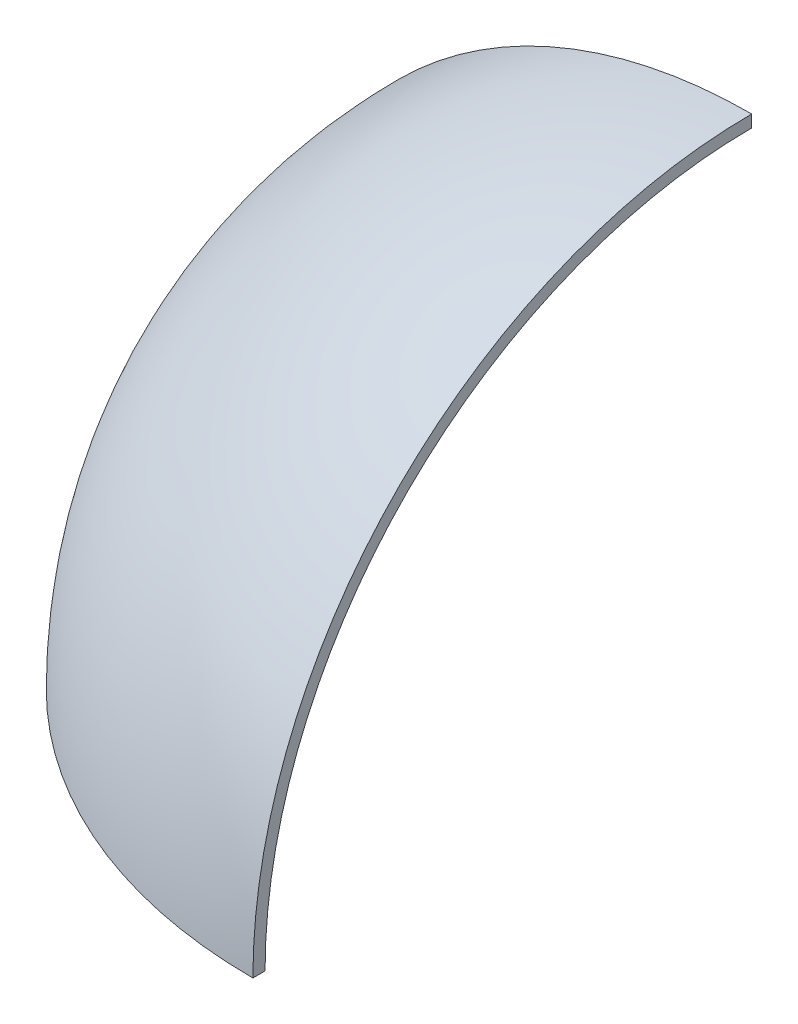
ISO-10303-21;
HEADER;
FILE_DESCRIPTION(('STEP AP214'),'2;1');
FILE_NAME('part.step','',(''),(''),'','','');
FILE_SCHEMA(('AUTOMOTIVE_DESIGN { 1 0 10303 214 1 1 1 1 }'));
ENDSEC;
DATA;
#1=APPLICATION_CONTEXT('core data for automotive mechanical design processes');
#2=APPLICATION_PROTOCOL_DEFINITION('international standard','automotive_design',2000,#1);
#3=PRODUCT_CONTEXT('',#1,'mechanical');
#4=PRODUCT('Part','Part','',(#3));
#5=PRODUCT_RELATED_PRODUCT_CATEGORY('part','',(#4));
#6=PRODUCT_DEFINITION_FORMATION('','',#4);
#7=PRODUCT_DEFINITION_CONTEXT('part definition',#1,'design');
#8=PRODUCT_DEFINITION('design','',#6,#7);
#9=PRODUCT_DEFINITION_SHAPE('','',#8);
#10=(LENGTH_UNIT() NAMED_UNIT(*) SI_UNIT(.MILLI.,.METRE.));
#11=(NAMED_UNIT(*) PLANE_ANGLE_UNIT() SI_UNIT($,.RADIAN.));
#12=(NAMED_UNIT(*) SI_UNIT($,.STERADIAN.) SOLID_ANGLE_UNIT());
#13=UNCERTAINTY_MEASURE_WITH_UNIT(LENGTH_MEASURE(1.E-05),#10,'distance_accuracy_value','');
#14=(GEOMETRIC_REPRESENTATION_CONTEXT(3) GLOBAL_UNCERTAINTY_ASSIGNED_CONTEXT((#13)) GLOBAL_UNIT_ASSIGNED_CONTEXT((#10,
#11,#12)) REPRESENTATION_CONTEXT('',''));
#15=CARTESIAN_POINT('',(0.,0.,0.));
#16=DIRECTION('',(0.,0.,1.));
#17=DIRECTION('',(1.,0.,0.));
#18=AXIS2_PLACEMENT_3D('',#15,#16,#17);
#19=CARTESIAN_POINT('',(5.72602939570275E-12,0.,5.72602939570273E-12));
#20=DIRECTION('',(1.43150734892568E-13,-1.,0.));
#21=DIRECTION('',(0.,0.,1.));
#22=AXIS2_PLACEMENT_3D('',#19,#20,#21);
#23=SPHERICAL_SURFACE('',#22,40.);
#24=CARTESIAN_POINT('',(0.,0.,0.));
#25=DIRECTION('',(0.,0.,-1.));
#26=DIRECTION('',(1.,0.,0.));
#27=AXIS2_PLACEMENT_3D('',#24,#25,#26);
#28=CIRCLE('',#27,40.);
#29=CARTESIAN_POINT('',(-40.,0.,0.));
#30=VERTEX_POINT('',#29);
#31=CARTESIAN_POINT('',(0.,40.,0.));
#32=VERTEX_POINT('',#31);
#33=EDGE_CURVE('E71',#30,#32,#28,.T.);
#34=ORIENTED_EDGE('',*,*,#33,.T.);
#35=CARTESIAN_POINT('',(5.72602939570275E-12,0.,5.72602939570273E-12));
#36=DIRECTION('',(-1.,-1.43150734892568E-13,0.));
#37=DIRECTION('',(0.,-1.43150734892569E-13,-1.));
#38=AXIS2_PLACEMENT_3D('',#35,#36,#37);
#39=CIRCLE('',#38,40.);
#40=CARTESIAN_POINT('',(5.86568864925566E-12,5.72113080850616E-12,40.0000000000057));
#41=VERTEX_POINT('',#40);
#42=EDGE_CURVE('E76',#41,#32,#39,.T.);
#43=ORIENTED_EDGE('',*,*,#42,.F.);
#44=CARTESIAN_POINT('',(5.72602939570191E-12,5.72458747072346E-12,0.));
#45=DIRECTION('',(1.43150734892568E-13,-1.,0.));
#46=DIRECTION('',(1.,1.43150734892568E-13,0.));
#47=AXIS2_PLACEMENT_3D('',#44,#45,#46);
#48=CIRCLE('',#47,40.0000000000057);
#49=EDGE_CURVE('E39',#41,#30,#48,.T.);
#50=ORIENTED_EDGE('',*,*,#49,.T.);
#51=EDGE_LOOP('',(#34,#43,#50));
#52=FACE_BOUND('',#51,.T.);
#53=ADVANCED_FACE('F31',(#52),#23,.F.);
#54=CARTESIAN_POINT('',(5.72602939570275E-12,0.,5.72602939570273E-12));
#55=DIRECTION('',(1.43150734892568E-13,-1.,0.));
#56=DIRECTION('',(0.,0.,-1.));
#57=AXIS2_PLACEMENT_3D('',#54,#55,#56);
#58=SPHERICAL_SURFACE('',#57,41.);
#59=CARTESIAN_POINT('',(5.72602939570193E-12,5.59968738045313E-12,0.));
#60=DIRECTION('',(1.43150734892568E-13,-1.,0.));
#61=DIRECTION('',(1.,1.43150734892568E-13,0.));
#62=AXIS2_PLACEMENT_3D('',#59,#60,#61);
#63=CIRCLE('',#62,41.0000000000057);
#64=CARTESIAN_POINT('',(5.86918013059452E-12,5.60108631841404E-12,41.0000000000057));
#65=VERTEX_POINT('',#64);
#66=CARTESIAN_POINT('',(-41.,-2.68093812181284E-13,0.));
#67=VERTEX_POINT('',#66);
#68=EDGE_CURVE('E11',#65,#67,#63,.T.);
#69=ORIENTED_EDGE('',*,*,#68,.F.);
#70=CARTESIAN_POINT('',(5.72602939570275E-12,0.,5.72602939570273E-12));
#71=DIRECTION('',(1.,1.43150734892568E-13,0.));
#72=DIRECTION('',(0.,-1.43150734892569E-13,-1.));
#73=AXIS2_PLACEMENT_3D('',#70,#71,#72);
#74=CIRCLE('',#73,41.);
#75=CARTESIAN_POINT('',(-1.43150734892567E-13,41.,0.));
#76=VERTEX_POINT('',#75);
#77=EDGE_CURVE('E68',#76,#65,#74,.T.);
#78=ORIENTED_EDGE('',*,*,#77,.F.);
#79=CARTESIAN_POINT('',(0.,0.,0.));
#80=DIRECTION('',(0.,0.,1.));
#81=DIRECTION('',(1.,0.,0.));
#82=AXIS2_PLACEMENT_3D('',#79,#80,#81);
#83=CIRCLE('',#82,41.);
#84=EDGE_CURVE('E67',#76,#67,#83,.T.);
#85=ORIENTED_EDGE('',*,*,#84,.T.);
#86=EDGE_LOOP('',(#69,#78,#85));
#87=FACE_BOUND('',#86,.T.);
#88=ADVANCED_FACE('F33',(#87),#58,.T.);
#89=CARTESIAN_POINT('',(5.86568864925567E-12,5.6611085634601E-12,40.0000000000057));
#90=DIRECTION('',(-1.43150734892568E-13,1.,0.));
#91=DIRECTION('',(-1.,-1.43150734892568E-13,0.));
#92=AXIS2_PLACEMENT_3D('',#89,#90,#91);
#93=PLANE('',#92);
#94=DIRECTION('',(0.,1.38252147695978E-13,-1.));
#95=VECTOR('',#94,1.);
#96=CARTESIAN_POINT('',(5.86568864925566E-12,5.72113080850616E-12,40.0000000000057));
#97=LINE('',#96,#95);
#98=EDGE_CURVE('E66',#65,#41,#97,.T.);
#99=ORIENTED_EDGE('',*,*,#98,.F.);
#100=ORIENTED_EDGE('',*,*,#68,.T.);
#101=DIRECTION('',(1.,2.81402882588547E-13,0.));
#102=VECTOR('',#101,1.);
#103=CARTESIAN_POINT('',(-40.,0.,0.));
#104=LINE('',#103,#102);
#105=EDGE_CURVE('E64',#67,#30,#104,.T.);
#106=ORIENTED_EDGE('',*,*,#105,.T.);
#107=ORIENTED_EDGE('',*,*,#49,.F.);
#108=EDGE_LOOP('',(#99,#100,#106,#107));
#109=FACE_BOUND('',#108,.T.);
#110=ADVANCED_FACE('F62',(#109),#93,.F.);
#111=CARTESIAN_POINT('',(5.72602939570275E-12,0.,5.72602939570273E-12));
#112=DIRECTION('',(1.,1.43150734892568E-13,0.));
#113=DIRECTION('',(0.,-1.43150734892569E-13,-1.));
#114=AXIS2_PLACEMENT_3D('',#111,#112,#113);
#115=PLANE('',#114);
#116=ORIENTED_EDGE('',*,*,#42,.T.);
#117=DIRECTION('',(-1.43150734892568E-13,1.,0.));
#118=VECTOR('',#117,1.);
#119=CARTESIAN_POINT('',(0.,40.,0.));
#120=LINE('',#119,#118);
#121=EDGE_CURVE('E79',#32,#76,#120,.T.);
#122=ORIENTED_EDGE('',*,*,#121,.T.);
#123=ORIENTED_EDGE('',*,*,#77,.T.);
#124=ORIENTED_EDGE('',*,*,#98,.T.);
#125=EDGE_LOOP('',(#116,#122,#123,#124));
#126=FACE_BOUND('',#125,.T.);
#127=ADVANCED_FACE('F87',(#126),#115,.T.);
#128=CARTESIAN_POINT('',(0.,0.,0.));
#129=DIRECTION('',(0.,0.,1.));
#130=DIRECTION('',(1.,0.,0.));
#131=AXIS2_PLACEMENT_3D('',#128,#129,#130);
#132=PLANE('',#131);
#133=ORIENTED_EDGE('',*,*,#33,.F.);
#134=ORIENTED_EDGE('',*,*,#105,.F.);
#135=ORIENTED_EDGE('',*,*,#84,.F.);
#136=ORIENTED_EDGE('',*,*,#121,.F.);
#137=EDGE_LOOP('',(#133,#134,#135,#136));
#138=FACE_BOUND('',#137,.T.);
#139=ADVANCED_FACE('F74',(#138),#132,.F.);
#140=CLOSED_SHELL('',(#53,#88,#110,#127,#139));
#141=MANIFOLD_SOLID_BREP('B2',#140);
#142=ADVANCED_BREP_SHAPE_REPRESENTATION('',(#18,#141),#14);
#143=SHAPE_DEFINITION_REPRESENTATION(#9,#142);
ENDSEC;
END-ISO-10303-21;
